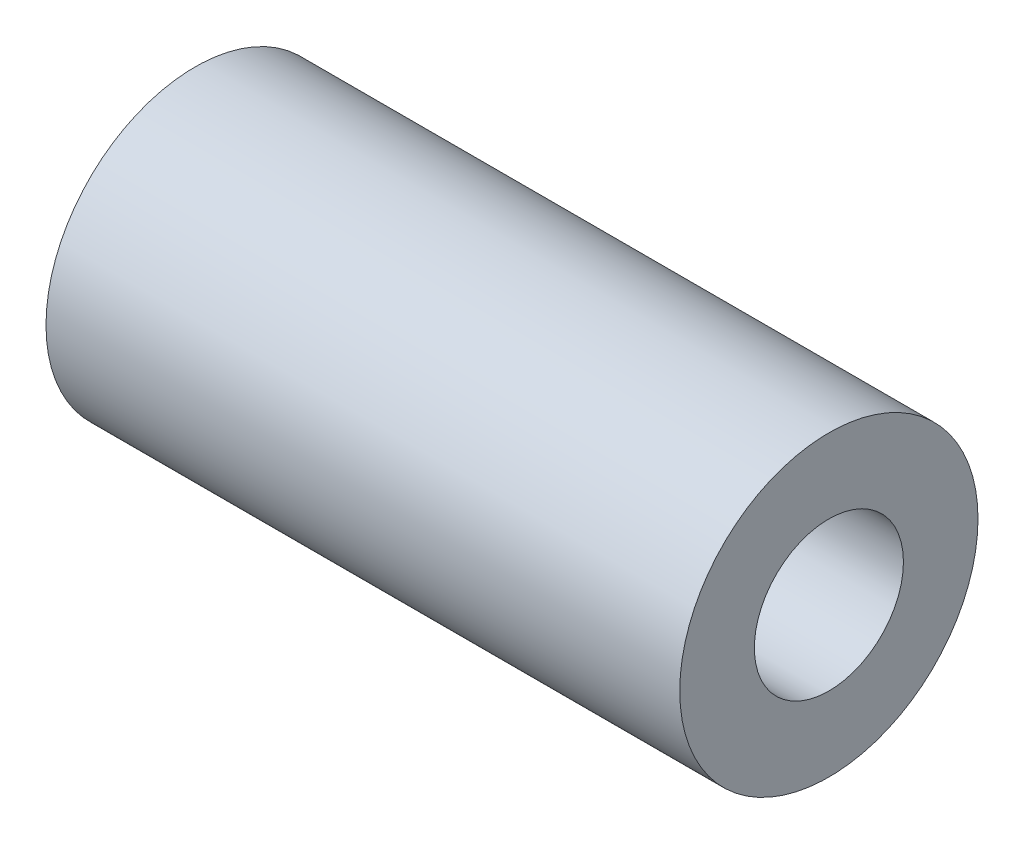
ISO-10303-21;
HEADER;
FILE_DESCRIPTION(('STEP AP214'),'2;1');
FILE_NAME('part.step','',(''),(''),'','','');
FILE_SCHEMA(('AUTOMOTIVE_DESIGN { 1 0 10303 214 1 1 1 1 }'));
ENDSEC;
DATA;
#1=APPLICATION_CONTEXT('core data for automotive mechanical design processes');
#2=APPLICATION_PROTOCOL_DEFINITION('international standard','automotive_design',2000,#1);
#3=PRODUCT_CONTEXT('',#1,'mechanical');
#4=PRODUCT('Part','Part','',(#3));
#5=PRODUCT_RELATED_PRODUCT_CATEGORY('part','',(#4));
#6=PRODUCT_DEFINITION_FORMATION('','',#4);
#7=PRODUCT_DEFINITION_CONTEXT('part definition',#1,'design');
#8=PRODUCT_DEFINITION('design','',#6,#7);
#9=PRODUCT_DEFINITION_SHAPE('','',#8);
#10=(LENGTH_UNIT() NAMED_UNIT(*) SI_UNIT(.MILLI.,.METRE.));
#11=(NAMED_UNIT(*) PLANE_ANGLE_UNIT() SI_UNIT($,.RADIAN.));
#12=(NAMED_UNIT(*) SI_UNIT($,.STERADIAN.) SOLID_ANGLE_UNIT());
#13=UNCERTAINTY_MEASURE_WITH_UNIT(LENGTH_MEASURE(1.E-05),#10,'distance_accuracy_value','');
#14=(GEOMETRIC_REPRESENTATION_CONTEXT(3) GLOBAL_UNCERTAINTY_ASSIGNED_CONTEXT((#13)) GLOBAL_UNIT_ASSIGNED_CONTEXT((#10,
#11,#12)) REPRESENTATION_CONTEXT('',''));
#15=CARTESIAN_POINT('',(0.,0.,0.));
#16=DIRECTION('',(0.,0.,1.));
#17=DIRECTION('',(1.,0.,0.));
#18=AXIS2_PLACEMENT_3D('',#15,#16,#17);
#19=CARTESIAN_POINT('',(26.9875,0.,0.));
#20=DIRECTION('',(1.,0.,0.));
#21=DIRECTION('',(0.,0.,-1.));
#22=AXIS2_PLACEMENT_3D('',#19,#20,#21);
#23=PLANE('',#22);
#24=CARTESIAN_POINT('',(26.9875,0.,0.));
#25=DIRECTION('',(1.,0.,0.));
#26=DIRECTION('',(0.,0.,-1.));
#27=AXIS2_PLACEMENT_3D('',#24,#25,#26);
#28=CIRCLE('',#27,6.35);
#29=CARTESIAN_POINT('',(26.9875,0.,-6.35));
#30=VERTEX_POINT('',#29);
#31=EDGE_CURVE('E10',#30,#30,#28,.T.);
#32=ORIENTED_EDGE('',*,*,#31,.T.);
#33=EDGE_LOOP('',(#32));
#34=FACE_BOUND('',#33,.T.);
#35=CARTESIAN_POINT('',(26.9875,0.,0.));
#36=DIRECTION('',(1.,0.,0.));
#37=DIRECTION('',(0.,0.,-1.));
#38=AXIS2_PLACEMENT_3D('',#35,#36,#37);
#39=CIRCLE('',#38,3.175);
#40=CARTESIAN_POINT('',(26.9875,0.,-3.175));
#41=VERTEX_POINT('',#40);
#42=EDGE_CURVE('E42',#41,#41,#39,.T.);
#43=ORIENTED_EDGE('',*,*,#42,.F.);
#44=EDGE_LOOP('',(#43));
#45=FACE_BOUND('',#44,.T.);
#46=ADVANCED_FACE('F31',(#34,#45),#23,.T.);
#47=CARTESIAN_POINT('',(0.,0.,0.));
#48=DIRECTION('',(1.,0.,0.));
#49=DIRECTION('',(0.,0.,-1.));
#50=AXIS2_PLACEMENT_3D('',#47,#48,#49);
#51=PLANE('',#50);
#52=CARTESIAN_POINT('',(0.,0.,0.));
#53=DIRECTION('',(1.,0.,0.));
#54=DIRECTION('',(0.,0.,-1.));
#55=AXIS2_PLACEMENT_3D('',#52,#53,#54);
#56=CIRCLE('',#55,6.35);
#57=CARTESIAN_POINT('',(0.,0.,-6.35));
#58=VERTEX_POINT('',#57);
#59=EDGE_CURVE('E35',#58,#58,#56,.T.);
#60=ORIENTED_EDGE('',*,*,#59,.F.);
#61=EDGE_LOOP('',(#60));
#62=FACE_BOUND('',#61,.T.);
#63=CARTESIAN_POINT('',(0.,0.,0.));
#64=DIRECTION('',(1.,0.,0.));
#65=DIRECTION('',(0.,0.,-1.));
#66=AXIS2_PLACEMENT_3D('',#63,#64,#65);
#67=CIRCLE('',#66,3.175);
#68=CARTESIAN_POINT('',(0.,0.,-3.175));
#69=VERTEX_POINT('',#68);
#70=EDGE_CURVE('E44',#69,#69,#67,.T.);
#71=ORIENTED_EDGE('',*,*,#70,.T.);
#72=EDGE_LOOP('',(#71));
#73=FACE_BOUND('',#72,.T.);
#74=ADVANCED_FACE('F54',(#62,#73),#51,.F.);
#75=CARTESIAN_POINT('',(26.9875,0.,0.));
#76=DIRECTION('',(-1.,0.,0.));
#77=DIRECTION('',(0.,0.,1.));
#78=AXIS2_PLACEMENT_3D('',#75,#76,#77);
#79=CYLINDRICAL_SURFACE('',#78,6.35);
#80=ORIENTED_EDGE('',*,*,#31,.F.);
#81=EDGE_LOOP('',(#80));
#82=FACE_BOUND('',#81,.T.);
#83=ORIENTED_EDGE('',*,*,#59,.T.);
#84=EDGE_LOOP('',(#83));
#85=FACE_BOUND('',#84,.T.);
#86=ADVANCED_FACE('F33',(#82,#85),#79,.T.);
#87=CARTESIAN_POINT('',(26.9875,0.,0.));
#88=DIRECTION('',(-1.,0.,0.));
#89=DIRECTION('',(0.,0.,1.));
#90=AXIS2_PLACEMENT_3D('',#87,#88,#89);
#91=CYLINDRICAL_SURFACE('',#90,3.175);
#92=ORIENTED_EDGE('',*,*,#42,.T.);
#93=EDGE_LOOP('',(#92));
#94=FACE_BOUND('',#93,.T.);
#95=ORIENTED_EDGE('',*,*,#70,.F.);
#96=EDGE_LOOP('',(#95));
#97=FACE_BOUND('',#96,.T.);
#98=ADVANCED_FACE('F50',(#94,#97),#91,.F.);
#99=CLOSED_SHELL('',(#46,#74,#86,#98));
#100=MANIFOLD_SOLID_BREP('B2',#99);
#101=ADVANCED_BREP_SHAPE_REPRESENTATION('',(#18,#100),#14);
#102=SHAPE_DEFINITION_REPRESENTATION(#9,#101);
ENDSEC;
END-ISO-10303-21;
